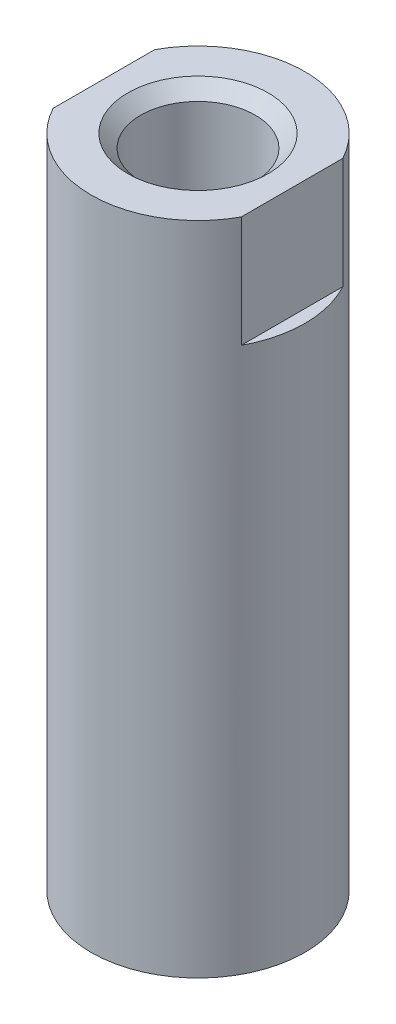
ISO-10303-21;
HEADER;
FILE_DESCRIPTION(('STEP AP214'),'2;1');
FILE_NAME('part.step','',(''),(''),'','','');
FILE_SCHEMA(('AUTOMOTIVE_DESIGN { 1 0 10303 214 1 1 1 1 }'));
ENDSEC;
DATA;
#1=APPLICATION_CONTEXT('core data for automotive mechanical design processes');
#2=APPLICATION_PROTOCOL_DEFINITION('international standard','automotive_design',2000,#1);
#3=PRODUCT_CONTEXT('',#1,'mechanical');
#4=PRODUCT('Part','Part','',(#3));
#5=PRODUCT_RELATED_PRODUCT_CATEGORY('part','',(#4));
#6=PRODUCT_DEFINITION_FORMATION('','',#4);
#7=PRODUCT_DEFINITION_CONTEXT('part definition',#1,'design');
#8=PRODUCT_DEFINITION('design','',#6,#7);
#9=PRODUCT_DEFINITION_SHAPE('','',#8);
#10=(LENGTH_UNIT() NAMED_UNIT(*) SI_UNIT(.MILLI.,.METRE.));
#11=(NAMED_UNIT(*) PLANE_ANGLE_UNIT() SI_UNIT($,.RADIAN.));
#12=(NAMED_UNIT(*) SI_UNIT($,.STERADIAN.) SOLID_ANGLE_UNIT());
#13=UNCERTAINTY_MEASURE_WITH_UNIT(LENGTH_MEASURE(1.E-05),#10,'distance_accuracy_value','');
#14=(GEOMETRIC_REPRESENTATION_CONTEXT(3) GLOBAL_UNCERTAINTY_ASSIGNED_CONTEXT((#13)) GLOBAL_UNIT_ASSIGNED_CONTEXT((#10,
#11,#12)) REPRESENTATION_CONTEXT('',''));
#15=CARTESIAN_POINT('',(0.,0.,0.));
#16=DIRECTION('',(0.,0.,1.));
#17=DIRECTION('',(1.,0.,0.));
#18=AXIS2_PLACEMENT_3D('',#15,#16,#17);
#19=CARTESIAN_POINT('',(0.,0.,0.));
#20=DIRECTION('',(0.,1.,0.));
#21=DIRECTION('',(0.,0.,1.));
#22=AXIS2_PLACEMENT_3D('',#19,#20,#21);
#23=CYLINDRICAL_SURFACE('',#22,3.175);
#24=DIRECTION('',(0.,1.,0.));
#25=VECTOR('',#24,1.);
#26=CARTESIAN_POINT('',(2.794,16.1798,1.50804144505382));
#27=LINE('',#26,#25);
#28=CARTESIAN_POINT('',(2.794,16.1798,1.50804144505382));
#29=VERTEX_POINT('',#28);
#30=CARTESIAN_POINT('',(2.794,19.4818,1.50804144505382));
#31=VERTEX_POINT('',#30);
#32=EDGE_CURVE('E86',#29,#31,#27,.T.);
#33=ORIENTED_EDGE('',*,*,#32,.T.);
#34=CARTESIAN_POINT('',(0.,19.4818,0.));
#35=DIRECTION('',(0.,1.,0.));
#36=DIRECTION('',(0.,0.,1.));
#37=AXIS2_PLACEMENT_3D('',#34,#35,#36);
#38=CIRCLE('',#37,3.175);
#39=CARTESIAN_POINT('',(-2.794,19.4818,1.50804144505382));
#40=VERTEX_POINT('',#39);
#41=EDGE_CURVE('E106',#40,#31,#38,.T.);
#42=ORIENTED_EDGE('',*,*,#41,.F.);
#43=DIRECTION('',(0.,1.,0.));
#44=VECTOR('',#43,1.);
#45=CARTESIAN_POINT('',(-2.794,16.1798,1.50804144505382));
#46=LINE('',#45,#44);
#47=CARTESIAN_POINT('',(-2.794,16.1798,1.50804144505382));
#48=VERTEX_POINT('',#47);
#49=EDGE_CURVE('E57',#48,#40,#46,.T.);
#50=ORIENTED_EDGE('',*,*,#49,.F.);
#51=CARTESIAN_POINT('',(0.,16.1798,0.));
#52=DIRECTION('',(0.,1.,0.));
#53=DIRECTION('',(0.,0.,1.));
#54=AXIS2_PLACEMENT_3D('',#51,#52,#53);
#55=CIRCLE('',#54,3.175);
#56=CARTESIAN_POINT('',(-2.794,16.1798,-1.50804144505382));
#57=VERTEX_POINT('',#56);
#58=EDGE_CURVE('E97',#57,#48,#55,.T.);
#59=ORIENTED_EDGE('',*,*,#58,.F.);
#60=DIRECTION('',(0.,1.,0.));
#61=VECTOR('',#60,1.);
#62=CARTESIAN_POINT('',(-2.794,16.1798,-1.50804144505382));
#63=LINE('',#62,#61);
#64=CARTESIAN_POINT('',(-2.794,19.4818,-1.50804144505382));
#65=VERTEX_POINT('',#64);
#66=EDGE_CURVE('E103',#57,#65,#63,.T.);
#67=ORIENTED_EDGE('',*,*,#66,.T.);
#68=CARTESIAN_POINT('',(2.794,19.4818,-1.50804144505382));
#69=VERTEX_POINT('',#68);
#70=EDGE_CURVE('E91',#69,#65,#38,.T.);
#71=ORIENTED_EDGE('',*,*,#70,.F.);
#72=DIRECTION('',(0.,1.,0.));
#73=VECTOR('',#72,1.);
#74=CARTESIAN_POINT('',(2.794,16.1798,-1.50804144505382));
#75=LINE('',#74,#73);
#76=CARTESIAN_POINT('',(2.794,16.1798,-1.50804144505382));
#77=VERTEX_POINT('',#76);
#78=EDGE_CURVE('E49',#77,#69,#75,.T.);
#79=ORIENTED_EDGE('',*,*,#78,.F.);
#80=CARTESIAN_POINT('',(0.,16.1798,0.));
#81=DIRECTION('',(0.,1.,0.));
#82=DIRECTION('',(0.,0.,1.));
#83=AXIS2_PLACEMENT_3D('',#80,#81,#82);
#84=CIRCLE('',#83,3.175);
#85=EDGE_CURVE('E78',#29,#77,#84,.T.);
#86=ORIENTED_EDGE('',*,*,#85,.F.);
#87=EDGE_LOOP('',(#33,#42,#50,#59,#67,#71,#79,#86));
#88=FACE_BOUND('',#87,.T.);
#89=CARTESIAN_POINT('',(0.,0.,0.));
#90=DIRECTION('',(0.,1.,0.));
#91=DIRECTION('',(0.,0.,1.));
#92=AXIS2_PLACEMENT_3D('',#89,#90,#91);
#93=CIRCLE('',#92,3.175);
#94=CARTESIAN_POINT('',(0.,0.,3.175));
#95=VERTEX_POINT('',#94);
#96=EDGE_CURVE('E109',#95,#95,#93,.T.);
#97=ORIENTED_EDGE('',*,*,#96,.T.);
#98=EDGE_LOOP('',(#97));
#99=FACE_BOUND('',#98,.T.);
#100=ADVANCED_FACE('F34',(#88,#99),#23,.T.);
#101=CARTESIAN_POINT('',(3.175,0.,0.));
#102=DIRECTION('',(0.,-1.,0.));
#103=DIRECTION('',(0.,0.,-1.));
#104=AXIS2_PLACEMENT_3D('',#101,#102,#103);
#105=PLANE('',#104);
#106=ORIENTED_EDGE('',*,*,#96,.F.);
#107=EDGE_LOOP('',(#106));
#108=FACE_BOUND('',#107,.T.);
#109=ADVANCED_FACE('F126',(#108),#105,.T.);
#110=CARTESIAN_POINT('',(0.,19.4818,0.));
#111=DIRECTION('',(0.,1.,0.));
#112=DIRECTION('',(0.,0.,1.));
#113=AXIS2_PLACEMENT_3D('',#110,#111,#112);
#114=PLANE('',#113);
#115=CARTESIAN_POINT('',(0.,19.4818,0.));
#116=DIRECTION('',(0.,1.,0.));
#117=DIRECTION('',(0.,0.,1.));
#118=AXIS2_PLACEMENT_3D('',#115,#116,#117);
#119=CIRCLE('',#118,2.08279999998869);
#120=CARTESIAN_POINT('',(0.,19.4818,2.08279999998869));
#121=VERTEX_POINT('',#120);
#122=EDGE_CURVE('E11',#121,#121,#119,.F.);
#123=ORIENTED_EDGE('',*,*,#122,.T.);
#124=EDGE_LOOP('',(#123));
#125=FACE_BOUND('',#124,.T.);
#126=DIRECTION('',(0.,0.,1.));
#127=VECTOR('',#126,1.);
#128=CARTESIAN_POINT('',(2.794,19.4818,-1.50804144505382));
#129=LINE('',#128,#127);
#130=EDGE_CURVE('E83',#69,#31,#129,.T.);
#131=ORIENTED_EDGE('',*,*,#130,.F.);
#132=ORIENTED_EDGE('',*,*,#70,.T.);
#133=DIRECTION('',(0.,0.,-1.));
#134=VECTOR('',#133,1.);
#135=CARTESIAN_POINT('',(-2.794,19.4818,1.50804144505382));
#136=LINE('',#135,#134);
#137=EDGE_CURVE('E93',#40,#65,#136,.T.);
#138=ORIENTED_EDGE('',*,*,#137,.F.);
#139=ORIENTED_EDGE('',*,*,#41,.T.);
#140=EDGE_LOOP('',(#131,#132,#138,#139));
#141=FACE_BOUND('',#140,.T.);
#142=ADVANCED_FACE('F130',(#125,#141),#114,.T.);
#143=CARTESIAN_POINT('',(-2.794,16.1798,1.50804144505382));
#144=DIRECTION('',(1.,0.,0.));
#145=DIRECTION('',(0.,0.,-1.));
#146=AXIS2_PLACEMENT_3D('',#143,#144,#145);
#147=PLANE('',#146);
#148=ORIENTED_EDGE('',*,*,#137,.T.);
#149=ORIENTED_EDGE('',*,*,#66,.F.);
#150=DIRECTION('',(0.,0.,-1.));
#151=VECTOR('',#150,1.);
#152=CARTESIAN_POINT('',(-2.794,16.1798,1.50804144505382));
#153=LINE('',#152,#151);
#154=EDGE_CURVE('E99',#48,#57,#153,.T.);
#155=ORIENTED_EDGE('',*,*,#154,.F.);
#156=ORIENTED_EDGE('',*,*,#49,.T.);
#157=EDGE_LOOP('',(#148,#149,#155,#156));
#158=FACE_BOUND('',#157,.T.);
#159=ADVANCED_FACE('F136',(#158),#147,.F.);
#160=CARTESIAN_POINT('',(0.,16.1798,0.));
#161=DIRECTION('',(0.,1.,0.));
#162=DIRECTION('',(0.,0.,1.));
#163=AXIS2_PLACEMENT_3D('',#160,#161,#162);
#164=PLANE('',#163);
#165=ORIENTED_EDGE('',*,*,#58,.T.);
#166=ORIENTED_EDGE('',*,*,#154,.T.);
#167=EDGE_LOOP('',(#165,#166));
#168=FACE_BOUND('',#167,.T.);
#169=ADVANCED_FACE('F140',(#168),#164,.T.);
#170=CARTESIAN_POINT('',(2.794,16.1798,-1.50804144505382));
#171=DIRECTION('',(-1.,0.,0.));
#172=DIRECTION('',(0.,0.,1.));
#173=AXIS2_PLACEMENT_3D('',#170,#171,#172);
#174=PLANE('',#173);
#175=ORIENTED_EDGE('',*,*,#130,.T.);
#176=ORIENTED_EDGE('',*,*,#32,.F.);
#177=DIRECTION('',(0.,0.,1.));
#178=VECTOR('',#177,1.);
#179=CARTESIAN_POINT('',(2.794,16.1798,-1.50804144505382));
#180=LINE('',#179,#178);
#181=EDGE_CURVE('E80',#77,#29,#180,.T.);
#182=ORIENTED_EDGE('',*,*,#181,.F.);
#183=ORIENTED_EDGE('',*,*,#78,.T.);
#184=EDGE_LOOP('',(#175,#176,#182,#183));
#185=FACE_BOUND('',#184,.T.);
#186=ADVANCED_FACE('F85',(#185),#174,.F.);
#187=CARTESIAN_POINT('',(0.,16.1798,0.));
#188=DIRECTION('',(0.,1.,0.));
#189=DIRECTION('',(0.,0.,1.));
#190=AXIS2_PLACEMENT_3D('',#187,#188,#189);
#191=PLANE('',#190);
#192=ORIENTED_EDGE('',*,*,#85,.T.);
#193=ORIENTED_EDGE('',*,*,#181,.T.);
#194=EDGE_LOOP('',(#192,#193));
#195=FACE_BOUND('',#194,.T.);
#196=ADVANCED_FACE('F79',(#195),#191,.T.);
#197=CARTESIAN_POINT('',(0.,7.7978,0.));
#198=DIRECTION('',(0.,-1.,0.));
#199=DIRECTION('',(0.,0.,-1.));
#200=AXIS2_PLACEMENT_3D('',#197,#198,#199);
#201=PLANE('',#200);
#202=CARTESIAN_POINT('',(0.,7.7978,0.));
#203=DIRECTION('',(0.,1.,0.));
#204=DIRECTION('',(0.,0.,1.));
#205=AXIS2_PLACEMENT_3D('',#202,#203,#204);
#206=CIRCLE('',#205,1.70052999999999);
#207=CARTESIAN_POINT('',(0.,7.7978,1.70052999999999));
#208=VERTEX_POINT('',#207);
#209=EDGE_CURVE('E154',#208,#208,#206,.T.);
#210=ORIENTED_EDGE('',*,*,#209,.T.);
#211=EDGE_LOOP('',(#210));
#212=FACE_BOUND('',#211,.T.);
#213=ADVANCED_FACE('F122',(#212),#201,.F.);
#214=CARTESIAN_POINT('',(0.,19.4818,0.));
#215=DIRECTION('',(0.,1.,0.));
#216=DIRECTION('',(0.,0.,1.));
#217=AXIS2_PLACEMENT_3D('',#214,#215,#216);
#218=CYLINDRICAL_SURFACE('',#217,1.70052999999999);
#219=CARTESIAN_POINT('',(0.,19.0995300000113,0.));
#220=DIRECTION('',(0.,1.,0.));
#221=DIRECTION('',(0.,0.,1.));
#222=AXIS2_PLACEMENT_3D('',#219,#220,#221);
#223=CIRCLE('',#222,1.70052999999999);
#224=CARTESIAN_POINT('',(0.,19.0995300000113,1.70052999999999));
#225=VERTEX_POINT('',#224);
#226=EDGE_CURVE('E42',#225,#225,#223,.T.);
#227=ORIENTED_EDGE('',*,*,#226,.T.);
#228=EDGE_LOOP('',(#227));
#229=FACE_BOUND('',#228,.T.);
#230=ORIENTED_EDGE('',*,*,#209,.F.);
#231=EDGE_LOOP('',(#230));
#232=FACE_BOUND('',#231,.T.);
#233=ADVANCED_FACE('F114',(#229,#232),#218,.F.);
#234=CARTESIAN_POINT('',(0.,19.0995300000113,0.));
#235=DIRECTION('',(0.,1.,0.));
#236=DIRECTION('',(0.,0.,1.));
#237=AXIS2_PLACEMENT_3D('',#234,#235,#236);
#238=CONICAL_SURFACE('',#237,1.70052999999999,0.785398163397452);
#239=ORIENTED_EDGE('',*,*,#122,.F.);
#240=EDGE_LOOP('',(#239));
#241=FACE_BOUND('',#240,.T.);
#242=ORIENTED_EDGE('',*,*,#226,.F.);
#243=EDGE_LOOP('',(#242));
#244=FACE_BOUND('',#243,.T.);
#245=ADVANCED_FACE('F36',(#241,#244),#238,.F.);
#246=CLOSED_SHELL('',(#100,#109,#142,#159,#169,#186,#196,#213,#233,#245));
#247=MANIFOLD_SOLID_BREP('B2',#246);
#248=ADVANCED_BREP_SHAPE_REPRESENTATION('',(#18,#247),#14);
#249=SHAPE_DEFINITION_REPRESENTATION(#9,#248);
ENDSEC;
END-ISO-10303-21;
